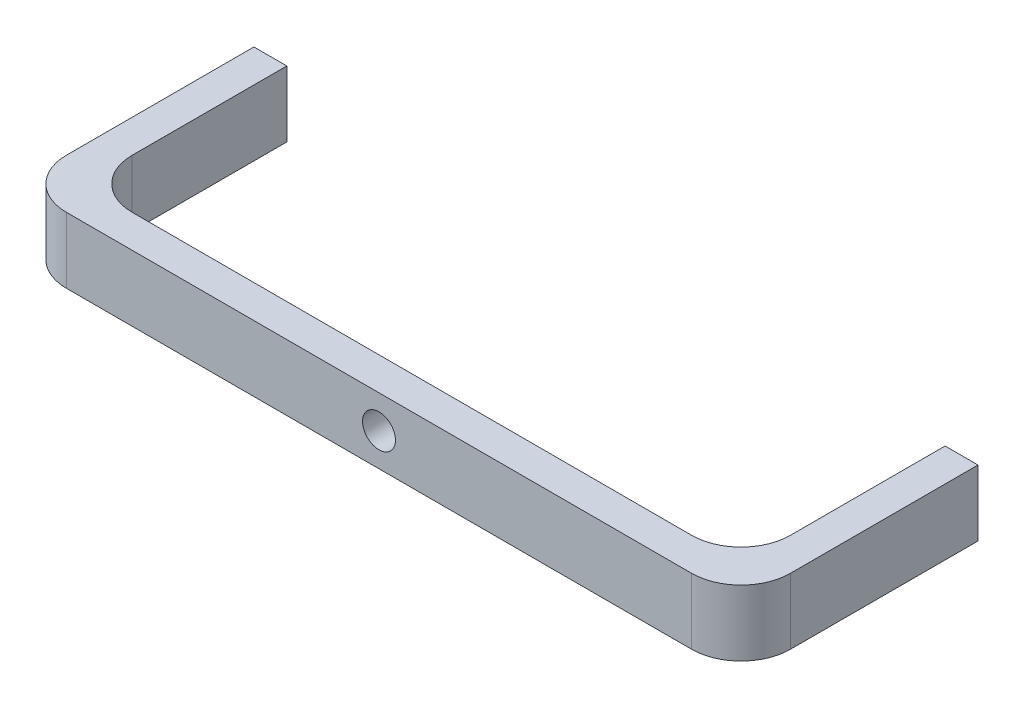
ISO-10303-21;
HEADER;
FILE_DESCRIPTION(('STEP AP214'),'2;1');
FILE_NAME('part.step','',(''),(''),'','','');
FILE_SCHEMA(('AUTOMOTIVE_DESIGN { 1 0 10303 214 1 1 1 1 }'));
ENDSEC;
DATA;
#1=APPLICATION_CONTEXT('core data for automotive mechanical design processes');
#2=APPLICATION_PROTOCOL_DEFINITION('international standard','automotive_design',2000,#1);
#3=PRODUCT_CONTEXT('',#1,'mechanical');
#4=PRODUCT('Part','Part','',(#3));
#5=PRODUCT_RELATED_PRODUCT_CATEGORY('part','',(#4));
#6=PRODUCT_DEFINITION_FORMATION('','',#4);
#7=PRODUCT_DEFINITION_CONTEXT('part definition',#1,'design');
#8=PRODUCT_DEFINITION('design','',#6,#7);
#9=PRODUCT_DEFINITION_SHAPE('','',#8);
#10=(LENGTH_UNIT() NAMED_UNIT(*) SI_UNIT(.MILLI.,.METRE.));
#11=(NAMED_UNIT(*) PLANE_ANGLE_UNIT() SI_UNIT($,.RADIAN.));
#12=(NAMED_UNIT(*) SI_UNIT($,.STERADIAN.) SOLID_ANGLE_UNIT());
#13=UNCERTAINTY_MEASURE_WITH_UNIT(LENGTH_MEASURE(1.E-05),#10,'distance_accuracy_value','');
#14=(GEOMETRIC_REPRESENTATION_CONTEXT(3) GLOBAL_UNCERTAINTY_ASSIGNED_CONTEXT((#13)) GLOBAL_UNIT_ASSIGNED_CONTEXT((#10,
#11,#12)) REPRESENTATION_CONTEXT('',''));
#15=CARTESIAN_POINT('',(0.,0.,0.));
#16=DIRECTION('',(0.,0.,1.));
#17=DIRECTION('',(1.,0.,0.));
#18=AXIS2_PLACEMENT_3D('',#15,#16,#17);
#19=CARTESIAN_POINT('',(139.7,25.4,6.35));
#20=DIRECTION('',(-1.,0.,0.));
#21=DIRECTION('',(0.,0.,1.));
#22=AXIS2_PLACEMENT_3D('',#19,#20,#21);
#23=PLANE('',#22);
#24=DIRECTION('',(0.,0.,-1.));
#25=VECTOR('',#24,1.);
#26=CARTESIAN_POINT('',(139.7,25.4,6.35));
#27=LINE('',#26,#25);
#28=CARTESIAN_POINT('',(139.7,25.4,-12.7));
#29=VERTEX_POINT('',#28);
#30=CARTESIAN_POINT('',(139.7,25.4,-85.09));
#31=VERTEX_POINT('',#30);
#32=EDGE_CURVE('E123',#29,#31,#27,.T.);
#33=ORIENTED_EDGE('',*,*,#32,.F.);
#34=DIRECTION('',(0.,-1.,0.));
#35=VECTOR('',#34,1.);
#36=CARTESIAN_POINT('',(139.7,25.4,-12.7));
#37=LINE('',#36,#35);
#38=CARTESIAN_POINT('',(139.7,0.,-12.7));
#39=VERTEX_POINT('',#38);
#40=EDGE_CURVE('E195',#29,#39,#37,.T.);
#41=ORIENTED_EDGE('',*,*,#40,.T.);
#42=DIRECTION('',(0.,0.,-1.));
#43=VECTOR('',#42,1.);
#44=CARTESIAN_POINT('',(139.7,0.,6.35));
#45=LINE('',#44,#43);
#46=CARTESIAN_POINT('',(139.7,0.,-85.09));
#47=VERTEX_POINT('',#46);
#48=EDGE_CURVE('E141',#39,#47,#45,.T.);
#49=ORIENTED_EDGE('',*,*,#48,.T.);
#50=DIRECTION('',(0.,-1.,0.));
#51=VECTOR('',#50,1.);
#52=CARTESIAN_POINT('',(139.7,25.4,-85.09));
#53=LINE('',#52,#51);
#54=EDGE_CURVE('E139',#31,#47,#53,.T.);
#55=ORIENTED_EDGE('',*,*,#54,.F.);
#56=EDGE_LOOP('',(#33,#41,#49,#55));
#57=FACE_BOUND('',#56,.T.);
#58=ADVANCED_FACE('F35',(#57),#23,.F.);
#59=CARTESIAN_POINT('',(127.,25.4,-85.09));
#60=DIRECTION('',(0.,0.,1.));
#61=DIRECTION('',(1.,0.,0.));
#62=AXIS2_PLACEMENT_3D('',#59,#60,#61);
#63=PLANE('',#62);
#64=DIRECTION('',(-1.,0.,0.));
#65=VECTOR('',#64,1.);
#66=CARTESIAN_POINT('',(127.,0.,-85.09));
#67=LINE('',#66,#65);
#68=CARTESIAN_POINT('',(127.,0.,-85.09));
#69=VERTEX_POINT('',#68);
#70=EDGE_CURVE('E165',#47,#69,#67,.T.);
#71=ORIENTED_EDGE('',*,*,#70,.T.);
#72=DIRECTION('',(0.,-1.,0.));
#73=VECTOR('',#72,1.);
#74=CARTESIAN_POINT('',(127.,25.4,-85.09));
#75=LINE('',#74,#73);
#76=CARTESIAN_POINT('',(127.,25.4,-85.09));
#77=VERTEX_POINT('',#76);
#78=EDGE_CURVE('E145',#77,#69,#75,.T.);
#79=ORIENTED_EDGE('',*,*,#78,.F.);
#80=DIRECTION('',(-1.,0.,0.));
#81=VECTOR('',#80,1.);
#82=CARTESIAN_POINT('',(127.,25.4,-85.09));
#83=LINE('',#82,#81);
#84=EDGE_CURVE('E129',#31,#77,#83,.T.);
#85=ORIENTED_EDGE('',*,*,#84,.F.);
#86=ORIENTED_EDGE('',*,*,#54,.T.);
#87=EDGE_LOOP('',(#71,#79,#85,#86));
#88=FACE_BOUND('',#87,.T.);
#89=ADVANCED_FACE('F147',(#88),#63,.F.);
#90=CARTESIAN_POINT('',(127.,25.4,-6.35));
#91=DIRECTION('',(1.,0.,0.));
#92=DIRECTION('',(0.,0.,-1.));
#93=AXIS2_PLACEMENT_3D('',#90,#91,#92);
#94=PLANE('',#93);
#95=DIRECTION('',(0.,0.,1.));
#96=VECTOR('',#95,1.);
#97=CARTESIAN_POINT('',(127.,0.,-6.35));
#98=LINE('',#97,#96);
#99=CARTESIAN_POINT('',(127.,0.,-25.4));
#100=VERTEX_POINT('',#99);
#101=EDGE_CURVE('E168',#69,#100,#98,.T.);
#102=ORIENTED_EDGE('',*,*,#101,.T.);
#103=DIRECTION('',(0.,-1.,0.));
#104=VECTOR('',#103,1.);
#105=CARTESIAN_POINT('',(127.,25.4,-25.4));
#106=LINE('',#105,#104);
#107=CARTESIAN_POINT('',(127.,25.4,-25.4));
#108=VERTEX_POINT('',#107);
#109=EDGE_CURVE('E193',#100,#108,#106,.F.);
#110=ORIENTED_EDGE('',*,*,#109,.T.);
#111=DIRECTION('',(0.,0.,1.));
#112=VECTOR('',#111,1.);
#113=CARTESIAN_POINT('',(127.,25.4,-6.35));
#114=LINE('',#113,#112);
#115=EDGE_CURVE('E150',#77,#108,#114,.T.);
#116=ORIENTED_EDGE('',*,*,#115,.F.);
#117=ORIENTED_EDGE('',*,*,#78,.T.);
#118=EDGE_LOOP('',(#102,#110,#116,#117));
#119=FACE_BOUND('',#118,.T.);
#120=ADVANCED_FACE('F254',(#119),#94,.F.);
#121=CARTESIAN_POINT('',(-127.,25.4,-6.35));
#122=DIRECTION('',(0.,0.,1.));
#123=DIRECTION('',(1.,0.,0.));
#124=AXIS2_PLACEMENT_3D('',#121,#122,#123);
#125=PLANE('',#124);
#126=CARTESIAN_POINT('',(0.,12.7,-6.34999999999999));
#127=DIRECTION('',(0.,0.,1.));
#128=DIRECTION('',(1.,0.,0.));
#129=AXIS2_PLACEMENT_3D('',#126,#127,#128);
#130=CIRCLE('',#129,6.35);
#131=CARTESIAN_POINT('',(6.35,12.7,-6.34999999999999));
#132=VERTEX_POINT('',#131);
#133=EDGE_CURVE('E166',#132,#132,#130,.T.);
#134=ORIENTED_EDGE('',*,*,#133,.T.);
#135=EDGE_LOOP('',(#134));
#136=FACE_BOUND('',#135,.T.);
#137=DIRECTION('',(-1.,0.,0.));
#138=VECTOR('',#137,1.);
#139=CARTESIAN_POINT('',(-127.,25.4,-6.35));
#140=LINE('',#139,#138);
#141=CARTESIAN_POINT('',(107.95,25.4,-6.35));
#142=VERTEX_POINT('',#141);
#143=CARTESIAN_POINT('',(-107.95,25.4,-6.35));
#144=VERTEX_POINT('',#143);
#145=EDGE_CURVE('E152',#142,#144,#140,.T.);
#146=ORIENTED_EDGE('',*,*,#145,.F.);
#147=DIRECTION('',(0.,-1.,0.));
#148=VECTOR('',#147,1.);
#149=CARTESIAN_POINT('',(107.95,0.,-6.35));
#150=LINE('',#149,#148);
#151=CARTESIAN_POINT('',(107.95,0.,-6.35));
#152=VERTEX_POINT('',#151);
#153=EDGE_CURVE('E190',#142,#152,#150,.T.);
#154=ORIENTED_EDGE('',*,*,#153,.T.);
#155=DIRECTION('',(-1.,0.,0.));
#156=VECTOR('',#155,1.);
#157=CARTESIAN_POINT('',(-127.,0.,-6.35));
#158=LINE('',#157,#156);
#159=CARTESIAN_POINT('',(-107.95,0.,-6.35));
#160=VERTEX_POINT('',#159);
#161=EDGE_CURVE('E171',#152,#160,#158,.T.);
#162=ORIENTED_EDGE('',*,*,#161,.T.);
#163=DIRECTION('',(0.,-1.,0.));
#164=VECTOR('',#163,1.);
#165=CARTESIAN_POINT('',(-107.95,25.4,-6.35));
#166=LINE('',#165,#164);
#167=EDGE_CURVE('E144',#160,#144,#166,.F.);
#168=ORIENTED_EDGE('',*,*,#167,.T.);
#169=EDGE_LOOP('',(#146,#154,#162,#168));
#170=FACE_BOUND('',#169,.T.);
#171=ADVANCED_FACE('F226',(#136,#170),#125,.F.);
#172=CARTESIAN_POINT('',(-127.,25.4,-6.35));
#173=DIRECTION('',(-1.,0.,0.));
#174=DIRECTION('',(0.,0.,1.));
#175=AXIS2_PLACEMENT_3D('',#172,#173,#174);
#176=PLANE('',#175);
#177=DIRECTION('',(0.,0.,-1.));
#178=VECTOR('',#177,1.);
#179=CARTESIAN_POINT('',(-127.,25.4,-6.35));
#180=LINE('',#179,#178);
#181=CARTESIAN_POINT('',(-127.,25.4,-25.4));
#182=VERTEX_POINT('',#181);
#183=CARTESIAN_POINT('',(-127.,25.4,-85.09));
#184=VERTEX_POINT('',#183);
#185=EDGE_CURVE('E157',#182,#184,#180,.T.);
#186=ORIENTED_EDGE('',*,*,#185,.F.);
#187=DIRECTION('',(0.,-1.,0.));
#188=VECTOR('',#187,1.);
#189=CARTESIAN_POINT('',(-127.,0.,-25.4));
#190=LINE('',#189,#188);
#191=CARTESIAN_POINT('',(-127.,0.,-25.4));
#192=VERTEX_POINT('',#191);
#193=EDGE_CURVE('E209',#182,#192,#190,.T.);
#194=ORIENTED_EDGE('',*,*,#193,.T.);
#195=DIRECTION('',(0.,0.,-1.));
#196=VECTOR('',#195,1.);
#197=CARTESIAN_POINT('',(-127.,0.,-6.35));
#198=LINE('',#197,#196);
#199=CARTESIAN_POINT('',(-127.,0.,-85.09));
#200=VERTEX_POINT('',#199);
#201=EDGE_CURVE('E174',#192,#200,#198,.T.);
#202=ORIENTED_EDGE('',*,*,#201,.T.);
#203=DIRECTION('',(0.,-1.,0.));
#204=VECTOR('',#203,1.);
#205=CARTESIAN_POINT('',(-127.,25.4,-85.09));
#206=LINE('',#205,#204);
#207=EDGE_CURVE('E185',#184,#200,#206,.T.);
#208=ORIENTED_EDGE('',*,*,#207,.F.);
#209=EDGE_LOOP('',(#186,#194,#202,#208));
#210=FACE_BOUND('',#209,.T.);
#211=ADVANCED_FACE('F230',(#210),#176,.F.);
#212=CARTESIAN_POINT('',(-127.,25.4,-85.09));
#213=DIRECTION('',(0.,0.,1.));
#214=DIRECTION('',(1.,0.,0.));
#215=AXIS2_PLACEMENT_3D('',#212,#213,#214);
#216=PLANE('',#215);
#217=DIRECTION('',(-1.,0.,0.));
#218=VECTOR('',#217,1.);
#219=CARTESIAN_POINT('',(-127.,0.,-85.09));
#220=LINE('',#219,#218);
#221=CARTESIAN_POINT('',(-139.7,0.,-85.09));
#222=VERTEX_POINT('',#221);
#223=EDGE_CURVE('E176',#200,#222,#220,.T.);
#224=ORIENTED_EDGE('',*,*,#223,.T.);
#225=DIRECTION('',(0.,-1.,0.));
#226=VECTOR('',#225,1.);
#227=CARTESIAN_POINT('',(-139.7,25.4,-85.09));
#228=LINE('',#227,#226);
#229=CARTESIAN_POINT('',(-139.7,25.4,-85.09));
#230=VERTEX_POINT('',#229);
#231=EDGE_CURVE('E163',#230,#222,#228,.T.);
#232=ORIENTED_EDGE('',*,*,#231,.F.);
#233=DIRECTION('',(-1.,0.,0.));
#234=VECTOR('',#233,1.);
#235=CARTESIAN_POINT('',(-127.,25.4,-85.09));
#236=LINE('',#235,#234);
#237=EDGE_CURVE('E159',#184,#230,#236,.T.);
#238=ORIENTED_EDGE('',*,*,#237,.F.);
#239=ORIENTED_EDGE('',*,*,#207,.T.);
#240=EDGE_LOOP('',(#224,#232,#238,#239));
#241=FACE_BOUND('',#240,.T.);
#242=ADVANCED_FACE('F236',(#241),#216,.F.);
#243=CARTESIAN_POINT('',(-139.7,25.4,6.35));
#244=DIRECTION('',(1.,0.,0.));
#245=DIRECTION('',(0.,0.,-1.));
#246=AXIS2_PLACEMENT_3D('',#243,#244,#245);
#247=PLANE('',#246);
#248=DIRECTION('',(0.,0.,1.));
#249=VECTOR('',#248,1.);
#250=CARTESIAN_POINT('',(-139.7,0.,6.35));
#251=LINE('',#250,#249);
#252=CARTESIAN_POINT('',(-139.7,0.,-12.7));
#253=VERTEX_POINT('',#252);
#254=EDGE_CURVE('E178',#222,#253,#251,.T.);
#255=ORIENTED_EDGE('',*,*,#254,.T.);
#256=DIRECTION('',(0.,-1.,0.));
#257=VECTOR('',#256,1.);
#258=CARTESIAN_POINT('',(-139.7,25.4,-12.7));
#259=LINE('',#258,#257);
#260=CARTESIAN_POINT('',(-139.7,25.4,-12.7));
#261=VERTEX_POINT('',#260);
#262=EDGE_CURVE('E50',#253,#261,#259,.F.);
#263=ORIENTED_EDGE('',*,*,#262,.T.);
#264=DIRECTION('',(0.,0.,1.));
#265=VECTOR('',#264,1.);
#266=CARTESIAN_POINT('',(-139.7,25.4,6.35));
#267=LINE('',#266,#265);
#268=EDGE_CURVE('E161',#230,#261,#267,.T.);
#269=ORIENTED_EDGE('',*,*,#268,.F.);
#270=ORIENTED_EDGE('',*,*,#231,.T.);
#271=EDGE_LOOP('',(#255,#263,#269,#270));
#272=FACE_BOUND('',#271,.T.);
#273=ADVANCED_FACE('F238',(#272),#247,.F.);
#274=CARTESIAN_POINT('',(-127.,25.4,6.35));
#275=DIRECTION('',(0.,0.,-1.));
#276=DIRECTION('',(-1.,0.,0.));
#277=AXIS2_PLACEMENT_3D('',#274,#275,#276);
#278=PLANE('',#277);
#279=CARTESIAN_POINT('',(0.,12.7,6.35));
#280=DIRECTION('',(0.,0.,1.));
#281=DIRECTION('',(1.,0.,0.));
#282=AXIS2_PLACEMENT_3D('',#279,#280,#281);
#283=CIRCLE('',#282,6.35);
#284=CARTESIAN_POINT('',(6.35,12.7,6.35));
#285=VERTEX_POINT('',#284);
#286=EDGE_CURVE('E281',#285,#285,#283,.T.);
#287=ORIENTED_EDGE('',*,*,#286,.F.);
#288=EDGE_LOOP('',(#287));
#289=FACE_BOUND('',#288,.T.);
#290=DIRECTION('',(1.,0.,0.));
#291=VECTOR('',#290,1.);
#292=CARTESIAN_POINT('',(-127.,0.,6.35));
#293=LINE('',#292,#291);
#294=CARTESIAN_POINT('',(-120.65,0.,6.35));
#295=VERTEX_POINT('',#294);
#296=CARTESIAN_POINT('',(120.65,0.,6.35));
#297=VERTEX_POINT('',#296);
#298=EDGE_CURVE('E180',#295,#297,#293,.T.);
#299=ORIENTED_EDGE('',*,*,#298,.T.);
#300=DIRECTION('',(0.,-1.,0.));
#301=VECTOR('',#300,1.);
#302=CARTESIAN_POINT('',(120.65,25.4,6.35));
#303=LINE('',#302,#301);
#304=CARTESIAN_POINT('',(120.65,25.4,6.35));
#305=VERTEX_POINT('',#304);
#306=EDGE_CURVE('E204',#297,#305,#303,.F.);
#307=ORIENTED_EDGE('',*,*,#306,.T.);
#308=DIRECTION('',(1.,0.,0.));
#309=VECTOR('',#308,1.);
#310=CARTESIAN_POINT('',(127.,25.4,6.35));
#311=LINE('',#310,#309);
#312=CARTESIAN_POINT('',(-120.65,25.4,6.34999999999995));
#313=VERTEX_POINT('',#312);
#314=EDGE_CURVE('E136',#313,#305,#311,.T.);
#315=ORIENTED_EDGE('',*,*,#314,.F.);
#316=DIRECTION('',(0.,-1.,0.));
#317=VECTOR('',#316,1.);
#318=CARTESIAN_POINT('',(-120.65,25.4,6.35));
#319=LINE('',#318,#317);
#320=EDGE_CURVE('E201',#313,#295,#319,.T.);
#321=ORIENTED_EDGE('',*,*,#320,.T.);
#322=EDGE_LOOP('',(#299,#307,#315,#321));
#323=FACE_BOUND('',#322,.T.);
#324=ADVANCED_FACE('F240',(#289,#323),#278,.F.);
#325=CARTESIAN_POINT('',(0.,25.4,0.));
#326=DIRECTION('',(0.,1.,0.));
#327=DIRECTION('',(0.,0.,1.));
#328=AXIS2_PLACEMENT_3D('',#325,#326,#327);
#329=PLANE('',#328);
#330=ORIENTED_EDGE('',*,*,#314,.T.);
#331=CARTESIAN_POINT('',(120.65,25.4,-12.7));
#332=DIRECTION('',(0.,1.,0.));
#333=DIRECTION('',(0.,0.,1.));
#334=AXIS2_PLACEMENT_3D('',#331,#332,#333);
#335=CIRCLE('',#334,19.05);
#336=EDGE_CURVE('E132',#305,#29,#335,.T.);
#337=ORIENTED_EDGE('',*,*,#336,.T.);
#338=ORIENTED_EDGE('',*,*,#32,.T.);
#339=ORIENTED_EDGE('',*,*,#84,.T.);
#340=ORIENTED_EDGE('',*,*,#115,.T.);
#341=CARTESIAN_POINT('',(107.95,25.4,-25.4));
#342=DIRECTION('',(0.,1.,0.));
#343=DIRECTION('',(0.,0.,1.));
#344=AXIS2_PLACEMENT_3D('',#341,#342,#343);
#345=CIRCLE('',#344,19.05);
#346=EDGE_CURVE('E215',#108,#142,#345,.F.);
#347=ORIENTED_EDGE('',*,*,#346,.T.);
#348=ORIENTED_EDGE('',*,*,#145,.T.);
#349=CARTESIAN_POINT('',(-107.95,25.4,-25.4));
#350=DIRECTION('',(0.,1.,0.));
#351=DIRECTION('',(0.,0.,1.));
#352=AXIS2_PLACEMENT_3D('',#349,#350,#351);
#353=CIRCLE('',#352,19.05);
#354=EDGE_CURVE('E11',#144,#182,#353,.F.);
#355=ORIENTED_EDGE('',*,*,#354,.T.);
#356=ORIENTED_EDGE('',*,*,#185,.T.);
#357=ORIENTED_EDGE('',*,*,#237,.T.);
#358=ORIENTED_EDGE('',*,*,#268,.T.);
#359=CARTESIAN_POINT('',(-120.65,25.4,-12.7));
#360=DIRECTION('',(0.,1.,0.));
#361=DIRECTION('',(0.,0.,1.));
#362=AXIS2_PLACEMENT_3D('',#359,#360,#361);
#363=CIRCLE('',#362,19.05);
#364=EDGE_CURVE('E206',#261,#313,#363,.T.);
#365=ORIENTED_EDGE('',*,*,#364,.T.);
#366=EDGE_LOOP('',(#330,#337,#338,#339,#340,#347,#348,#355,#356,#357,#358,#365));
#367=FACE_BOUND('',#366,.T.);
#368=ADVANCED_FACE('F126',(#367),#329,.T.);
#369=CARTESIAN_POINT('',(0.,0.,0.));
#370=DIRECTION('',(0.,1.,0.));
#371=DIRECTION('',(0.,0.,1.));
#372=AXIS2_PLACEMENT_3D('',#369,#370,#371);
#373=PLANE('',#372);
#374=ORIENTED_EDGE('',*,*,#48,.F.);
#375=CARTESIAN_POINT('',(120.65,0.,-12.7));
#376=DIRECTION('',(0.,1.,0.));
#377=DIRECTION('',(0.,0.,1.));
#378=AXIS2_PLACEMENT_3D('',#375,#376,#377);
#379=CIRCLE('',#378,19.05);
#380=EDGE_CURVE('E199',#39,#297,#379,.F.);
#381=ORIENTED_EDGE('',*,*,#380,.T.);
#382=ORIENTED_EDGE('',*,*,#298,.F.);
#383=CARTESIAN_POINT('',(-120.65,0.,-12.7));
#384=DIRECTION('',(0.,1.,0.));
#385=DIRECTION('',(0.,0.,1.));
#386=AXIS2_PLACEMENT_3D('',#383,#384,#385);
#387=CIRCLE('',#386,19.05);
#388=EDGE_CURVE('E197',#295,#253,#387,.F.);
#389=ORIENTED_EDGE('',*,*,#388,.T.);
#390=ORIENTED_EDGE('',*,*,#254,.F.);
#391=ORIENTED_EDGE('',*,*,#223,.F.);
#392=ORIENTED_EDGE('',*,*,#201,.F.);
#393=CARTESIAN_POINT('',(-107.95,0.,-25.4));
#394=DIRECTION('',(0.,1.,0.));
#395=DIRECTION('',(0.,0.,1.));
#396=AXIS2_PLACEMENT_3D('',#393,#394,#395);
#397=CIRCLE('',#396,19.05);
#398=EDGE_CURVE('E43',#192,#160,#397,.T.);
#399=ORIENTED_EDGE('',*,*,#398,.T.);
#400=ORIENTED_EDGE('',*,*,#161,.F.);
#401=CARTESIAN_POINT('',(107.95,0.,-25.4));
#402=DIRECTION('',(0.,1.,0.));
#403=DIRECTION('',(0.,0.,1.));
#404=AXIS2_PLACEMENT_3D('',#401,#402,#403);
#405=CIRCLE('',#404,19.05);
#406=EDGE_CURVE('E213',#152,#100,#405,.T.);
#407=ORIENTED_EDGE('',*,*,#406,.T.);
#408=ORIENTED_EDGE('',*,*,#101,.F.);
#409=ORIENTED_EDGE('',*,*,#70,.F.);
#410=EDGE_LOOP('',(#374,#381,#382,#389,#390,#391,#392,#399,#400,#407,#408,#409));
#411=FACE_BOUND('',#410,.T.);
#412=ADVANCED_FACE('F219',(#411),#373,.F.);
#413=CARTESIAN_POINT('',(0.,12.7,-85.09));
#414=DIRECTION('',(0.,0.,1.));
#415=DIRECTION('',(1.,0.,0.));
#416=AXIS2_PLACEMENT_3D('',#413,#414,#415);
#417=CYLINDRICAL_SURFACE('',#416,6.35);
#418=ORIENTED_EDGE('',*,*,#286,.T.);
#419=EDGE_LOOP('',(#418));
#420=FACE_BOUND('',#419,.T.);
#421=ORIENTED_EDGE('',*,*,#133,.F.);
#422=EDGE_LOOP('',(#421));
#423=FACE_BOUND('',#422,.T.);
#424=ADVANCED_FACE('F262',(#420,#423),#417,.F.);
#425=CARTESIAN_POINT('',(107.95,25.4,-25.4));
#426=DIRECTION('',(0.,1.,0.));
#427=DIRECTION('',(0.,0.,1.));
#428=AXIS2_PLACEMENT_3D('',#425,#426,#427);
#429=CYLINDRICAL_SURFACE('',#428,19.05);
#430=ORIENTED_EDGE('',*,*,#346,.F.);
#431=ORIENTED_EDGE('',*,*,#109,.F.);
#432=ORIENTED_EDGE('',*,*,#406,.F.);
#433=ORIENTED_EDGE('',*,*,#153,.F.);
#434=EDGE_LOOP('',(#430,#431,#432,#433));
#435=FACE_BOUND('',#434,.T.);
#436=ADVANCED_FACE('F258',(#435),#429,.F.);
#437=CARTESIAN_POINT('',(120.65,25.4,-12.7));
#438=DIRECTION('',(0.,-1.,0.));
#439=DIRECTION('',(0.,0.,-1.));
#440=AXIS2_PLACEMENT_3D('',#437,#438,#439);
#441=CYLINDRICAL_SURFACE('',#440,19.05);
#442=ORIENTED_EDGE('',*,*,#336,.F.);
#443=ORIENTED_EDGE('',*,*,#306,.F.);
#444=ORIENTED_EDGE('',*,*,#380,.F.);
#445=ORIENTED_EDGE('',*,*,#40,.F.);
#446=EDGE_LOOP('',(#442,#443,#444,#445));
#447=FACE_BOUND('',#446,.T.);
#448=ADVANCED_FACE('F261',(#447),#441,.T.);
#449=CARTESIAN_POINT('',(-107.95,25.4,-25.4));
#450=DIRECTION('',(0.,1.,0.));
#451=DIRECTION('',(0.,0.,1.));
#452=AXIS2_PLACEMENT_3D('',#449,#450,#451);
#453=CYLINDRICAL_SURFACE('',#452,19.05);
#454=ORIENTED_EDGE('',*,*,#354,.F.);
#455=ORIENTED_EDGE('',*,*,#167,.F.);
#456=ORIENTED_EDGE('',*,*,#398,.F.);
#457=ORIENTED_EDGE('',*,*,#193,.F.);
#458=EDGE_LOOP('',(#454,#455,#456,#457));
#459=FACE_BOUND('',#458,.T.);
#460=ADVANCED_FACE('F228',(#459),#453,.F.);
#461=CARTESIAN_POINT('',(-120.65,25.4,-12.7));
#462=DIRECTION('',(0.,-1.,0.));
#463=DIRECTION('',(0.,0.,-1.));
#464=AXIS2_PLACEMENT_3D('',#461,#462,#463);
#465=CYLINDRICAL_SURFACE('',#464,19.05);
#466=ORIENTED_EDGE('',*,*,#364,.F.);
#467=ORIENTED_EDGE('',*,*,#262,.F.);
#468=ORIENTED_EDGE('',*,*,#388,.F.);
#469=ORIENTED_EDGE('',*,*,#320,.F.);
#470=EDGE_LOOP('',(#466,#467,#468,#469));
#471=FACE_BOUND('',#470,.T.);
#472=ADVANCED_FACE('F37',(#471),#465,.T.);
#473=CLOSED_SHELL('',(#58,#89,#120,#171,#211,#242,#273,#324,#368,#412,#424,#436,#448,#460,#472));
#474=MANIFOLD_SOLID_BREP('B2',#473);
#475=ADVANCED_BREP_SHAPE_REPRESENTATION('',(#18,#474),#14);
#476=SHAPE_DEFINITION_REPRESENTATION(#9,#475);
ENDSEC;
END-ISO-10303-21;
